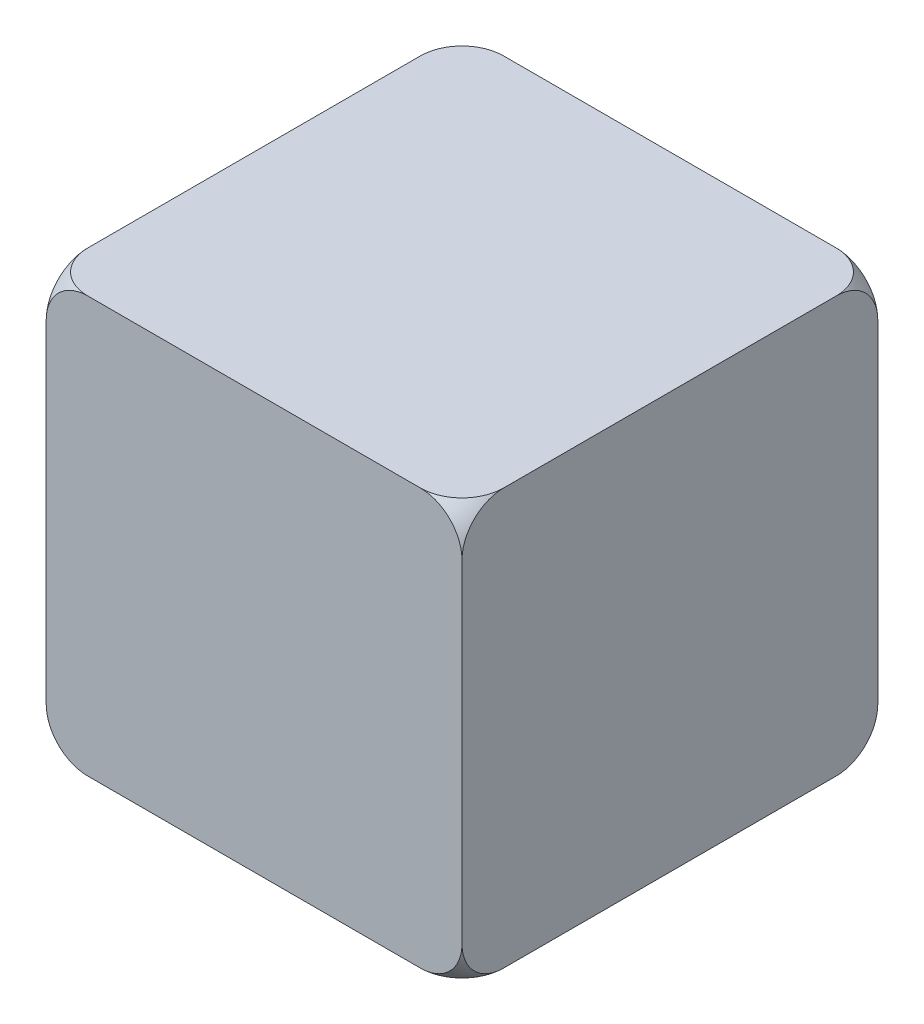
ISO-10303-21;
HEADER;
FILE_DESCRIPTION(('STEP AP214'),'2;1');
FILE_NAME('part.step','',(''),(''),'','','');
FILE_SCHEMA(('AUTOMOTIVE_DESIGN { 1 0 10303 214 1 1 1 1 }'));
ENDSEC;
DATA;
#1=APPLICATION_CONTEXT('core data for automotive mechanical design processes');
#2=APPLICATION_PROTOCOL_DEFINITION('international standard','automotive_design',2000,#1);
#3=PRODUCT_CONTEXT('',#1,'mechanical');
#4=PRODUCT('Part','Part','',(#3));
#5=PRODUCT_RELATED_PRODUCT_CATEGORY('part','',(#4));
#6=PRODUCT_DEFINITION_FORMATION('','',#4);
#7=PRODUCT_DEFINITION_CONTEXT('part definition',#1,'design');
#8=PRODUCT_DEFINITION('design','',#6,#7);
#9=PRODUCT_DEFINITION_SHAPE('','',#8);
#10=(LENGTH_UNIT() NAMED_UNIT(*) SI_UNIT(.MILLI.,.METRE.));
#11=(NAMED_UNIT(*) PLANE_ANGLE_UNIT() SI_UNIT($,.RADIAN.));
#12=(NAMED_UNIT(*) SI_UNIT($,.STERADIAN.) SOLID_ANGLE_UNIT());
#13=UNCERTAINTY_MEASURE_WITH_UNIT(LENGTH_MEASURE(1.E-05),#10,'distance_accuracy_value','');
#14=(GEOMETRIC_REPRESENTATION_CONTEXT(3) GLOBAL_UNCERTAINTY_ASSIGNED_CONTEXT((#13)) GLOBAL_UNIT_ASSIGNED_CONTEXT((#10,
#11,#12)) REPRESENTATION_CONTEXT('',''));
#15=CARTESIAN_POINT('',(0.,0.,0.));
#16=DIRECTION('',(0.,0.,1.));
#17=DIRECTION('',(1.,0.,0.));
#18=AXIS2_PLACEMENT_3D('',#15,#16,#17);
#19=CARTESIAN_POINT('',(0.,0.,-0.414213562373095));
#20=DIRECTION('',(-1.,0.,0.));
#21=DIRECTION('',(0.,0.,1.));
#22=AXIS2_PLACEMENT_3D('',#19,#20,#21);
#23=PLANE('',#22);
#24=DIRECTION('',(0.,-1.,0.));
#25=VECTOR('',#24,1.);
#26=CARTESIAN_POINT('',(0.,9.,0.));
#27=LINE('',#26,#25);
#28=CARTESIAN_POINT('',(0.,9.,0.));
#29=VERTEX_POINT('',#28);
#30=CARTESIAN_POINT('',(0.,1.,0.));
#31=VERTEX_POINT('',#30);
#32=EDGE_CURVE('E135',#29,#31,#27,.T.);
#33=ORIENTED_EDGE('',*,*,#32,.T.);
#34=CARTESIAN_POINT('',(0.,1.,1.));
#35=DIRECTION('',(-1.,0.,0.));
#36=DIRECTION('',(0.,0.,1.));
#37=AXIS2_PLACEMENT_3D('',#34,#35,#36);
#38=CIRCLE('',#37,1.);
#39=CARTESIAN_POINT('',(0.,0.,1.));
#40=VERTEX_POINT('',#39);
#41=EDGE_CURVE('E41',#31,#40,#38,.T.);
#42=ORIENTED_EDGE('',*,*,#41,.T.);
#43=DIRECTION('',(0.,0.,-1.));
#44=VECTOR('',#43,1.);
#45=CARTESIAN_POINT('',(0.,0.,9.));
#46=LINE('',#45,#44);
#47=CARTESIAN_POINT('',(0.,0.,9.));
#48=VERTEX_POINT('',#47);
#49=EDGE_CURVE('E48',#48,#40,#46,.T.);
#50=ORIENTED_EDGE('',*,*,#49,.F.);
#51=CARTESIAN_POINT('',(0.,1.,9.));
#52=DIRECTION('',(-1.,0.,0.));
#53=DIRECTION('',(0.,0.,1.));
#54=AXIS2_PLACEMENT_3D('',#51,#52,#53);
#55=CIRCLE('',#54,1.);
#56=CARTESIAN_POINT('',(0.,1.,10.));
#57=VERTEX_POINT('',#56);
#58=EDGE_CURVE('E109',#48,#57,#55,.T.);
#59=ORIENTED_EDGE('',*,*,#58,.T.);
#60=DIRECTION('',(0.,-1.,0.));
#61=VECTOR('',#60,1.);
#62=CARTESIAN_POINT('',(0.,9.,10.));
#63=LINE('',#62,#61);
#64=CARTESIAN_POINT('',(0.,9.,10.));
#65=VERTEX_POINT('',#64);
#66=EDGE_CURVE('E233',#65,#57,#63,.T.);
#67=ORIENTED_EDGE('',*,*,#66,.F.);
#68=CARTESIAN_POINT('',(0.,9.,9.));
#69=DIRECTION('',(-1.,0.,0.));
#70=DIRECTION('',(0.,0.,1.));
#71=AXIS2_PLACEMENT_3D('',#68,#69,#70);
#72=CIRCLE('',#71,1.00000000000001);
#73=CARTESIAN_POINT('',(0.,10.,9.));
#74=VERTEX_POINT('',#73);
#75=EDGE_CURVE('E79',#65,#74,#72,.T.);
#76=ORIENTED_EDGE('',*,*,#75,.T.);
#77=DIRECTION('',(0.,0.,-1.));
#78=VECTOR('',#77,1.);
#79=CARTESIAN_POINT('',(0.,10.,9.));
#80=LINE('',#79,#78);
#81=CARTESIAN_POINT('',(0.,10.,1.));
#82=VERTEX_POINT('',#81);
#83=EDGE_CURVE('E70',#74,#82,#80,.T.);
#84=ORIENTED_EDGE('',*,*,#83,.T.);
#85=CARTESIAN_POINT('',(0.,9.,1.));
#86=DIRECTION('',(-1.,0.,0.));
#87=DIRECTION('',(0.,0.,1.));
#88=AXIS2_PLACEMENT_3D('',#85,#86,#87);
#89=CIRCLE('',#88,1.00000000000001);
#90=EDGE_CURVE('E75',#82,#29,#89,.T.);
#91=ORIENTED_EDGE('',*,*,#90,.T.);
#92=EDGE_LOOP('',(#33,#42,#50,#59,#67,#76,#84,#91));
#93=FACE_BOUND('',#92,.T.);
#94=ADVANCED_FACE('F33',(#93),#23,.T.);
#95=CARTESIAN_POINT('',(0.,0.,-0.414213562373095));
#96=DIRECTION('',(0.,-1.,0.));
#97=DIRECTION('',(0.,0.,-1.));
#98=AXIS2_PLACEMENT_3D('',#95,#96,#97);
#99=PLANE('',#98);
#100=CARTESIAN_POINT('',(1.,0.,1.));
#101=DIRECTION('',(0.,-1.,0.));
#102=DIRECTION('',(0.,0.,-1.));
#103=AXIS2_PLACEMENT_3D('',#100,#101,#102);
#104=CIRCLE('',#103,1.);
#105=CARTESIAN_POINT('',(0.999999999999988,0.,0.));
#106=VERTEX_POINT('',#105);
#107=EDGE_CURVE('E130',#40,#106,#104,.T.);
#108=ORIENTED_EDGE('',*,*,#107,.T.);
#109=DIRECTION('',(-1.,0.,0.));
#110=VECTOR('',#109,1.);
#111=CARTESIAN_POINT('',(8.99999999999999,0.,0.));
#112=LINE('',#111,#110);
#113=CARTESIAN_POINT('',(8.99999999999999,0.,0.));
#114=VERTEX_POINT('',#113);
#115=EDGE_CURVE('E143',#114,#106,#112,.T.);
#116=ORIENTED_EDGE('',*,*,#115,.F.);
#117=CARTESIAN_POINT('',(9.,0.,1.));
#118=DIRECTION('',(0.,-1.,0.));
#119=DIRECTION('',(0.,0.,-1.));
#120=AXIS2_PLACEMENT_3D('',#117,#118,#119);
#121=CIRCLE('',#120,0.999999999999998);
#122=CARTESIAN_POINT('',(10.,0.,1.));
#123=VERTEX_POINT('',#122);
#124=EDGE_CURVE('E122',#114,#123,#121,.T.);
#125=ORIENTED_EDGE('',*,*,#124,.T.);
#126=DIRECTION('',(0.,0.,-1.));
#127=VECTOR('',#126,1.);
#128=CARTESIAN_POINT('',(9.99999999999999,0.,9.));
#129=LINE('',#128,#127);
#130=CARTESIAN_POINT('',(9.99999999999999,0.,9.));
#131=VERTEX_POINT('',#130);
#132=EDGE_CURVE('E56',#131,#123,#129,.T.);
#133=ORIENTED_EDGE('',*,*,#132,.F.);
#134=CARTESIAN_POINT('',(9.,0.,9.));
#135=DIRECTION('',(0.,-1.,0.));
#136=DIRECTION('',(0.,0.,-1.));
#137=AXIS2_PLACEMENT_3D('',#134,#135,#136);
#138=CIRCLE('',#137,0.999999999999998);
#139=CARTESIAN_POINT('',(8.99999999999999,0.,10.));
#140=VERTEX_POINT('',#139);
#141=EDGE_CURVE('E117',#131,#140,#138,.T.);
#142=ORIENTED_EDGE('',*,*,#141,.T.);
#143=DIRECTION('',(-1.,0.,0.));
#144=VECTOR('',#143,1.);
#145=CARTESIAN_POINT('',(8.99999999999999,0.,10.));
#146=LINE('',#145,#144);
#147=CARTESIAN_POINT('',(0.999999999999988,0.,10.));
#148=VERTEX_POINT('',#147);
#149=EDGE_CURVE('E192',#140,#148,#146,.T.);
#150=ORIENTED_EDGE('',*,*,#149,.T.);
#151=CARTESIAN_POINT('',(1.,0.,9.));
#152=DIRECTION('',(0.,-1.,0.));
#153=DIRECTION('',(0.,0.,-1.));
#154=AXIS2_PLACEMENT_3D('',#151,#152,#153);
#155=CIRCLE('',#154,1.);
#156=EDGE_CURVE('E107',#148,#48,#155,.T.);
#157=ORIENTED_EDGE('',*,*,#156,.T.);
#158=ORIENTED_EDGE('',*,*,#49,.T.);
#159=EDGE_LOOP('',(#108,#116,#125,#133,#142,#150,#157,#158));
#160=FACE_BOUND('',#159,.T.);
#161=ADVANCED_FACE('F140',(#160),#99,.T.);
#162=CARTESIAN_POINT('',(1.,1.,1.));
#163=DIRECTION('',(1.,0.,0.));
#164=DIRECTION('',(0.,-1.,0.));
#165=AXIS2_PLACEMENT_3D('',#162,#163,#164);
#166=SPHERICAL_SURFACE('',#165,1.4142135623731);
#167=ORIENTED_EDGE('',*,*,#41,.F.);
#168=CARTESIAN_POINT('',(1.,1.,0.));
#169=DIRECTION('',(0.,0.,1.));
#170=DIRECTION('',(1.,0.,0.));
#171=AXIS2_PLACEMENT_3D('',#168,#169,#170);
#172=CIRCLE('',#171,1.);
#173=EDGE_CURVE('E11',#31,#106,#172,.T.);
#174=ORIENTED_EDGE('',*,*,#173,.T.);
#175=ORIENTED_EDGE('',*,*,#107,.F.);
#176=EDGE_LOOP('',(#167,#174,#175));
#177=FACE_BOUND('',#176,.T.);
#178=ADVANCED_FACE('F35',(#177),#166,.T.);
#179=CARTESIAN_POINT('',(20.,0.,0.));
#180=DIRECTION('',(0.,0.,1.));
#181=DIRECTION('',(1.,0.,0.));
#182=AXIS2_PLACEMENT_3D('',#179,#180,#181);
#183=PLANE('',#182);
#184=ORIENTED_EDGE('',*,*,#173,.F.);
#185=ORIENTED_EDGE('',*,*,#32,.F.);
#186=CARTESIAN_POINT('',(0.999999999999988,9.,0.));
#187=DIRECTION('',(0.,0.,1.));
#188=DIRECTION('',(1.,0.,0.));
#189=AXIS2_PLACEMENT_3D('',#186,#187,#188);
#190=CIRCLE('',#189,1.);
#191=CARTESIAN_POINT('',(0.999999999999988,10.,0.));
#192=VERTEX_POINT('',#191);
#193=EDGE_CURVE('E99',#192,#29,#190,.T.);
#194=ORIENTED_EDGE('',*,*,#193,.F.);
#195=DIRECTION('',(-1.,0.,0.));
#196=VECTOR('',#195,1.);
#197=CARTESIAN_POINT('',(8.99999999999999,10.,0.));
#198=LINE('',#197,#196);
#199=CARTESIAN_POINT('',(8.99999999999999,10.,0.));
#200=VERTEX_POINT('',#199);
#201=EDGE_CURVE('E92',#200,#192,#198,.T.);
#202=ORIENTED_EDGE('',*,*,#201,.F.);
#203=CARTESIAN_POINT('',(8.99999999999999,9.,0.));
#204=DIRECTION('',(0.,0.,1.));
#205=DIRECTION('',(1.,0.,0.));
#206=AXIS2_PLACEMENT_3D('',#203,#204,#205);
#207=CIRCLE('',#206,0.999999999999998);
#208=CARTESIAN_POINT('',(9.99999999999999,9.,0.));
#209=VERTEX_POINT('',#208);
#210=EDGE_CURVE('E225',#209,#200,#207,.T.);
#211=ORIENTED_EDGE('',*,*,#210,.F.);
#212=DIRECTION('',(0.,-1.,0.));
#213=VECTOR('',#212,1.);
#214=CARTESIAN_POINT('',(10.,9.,0.));
#215=LINE('',#214,#213);
#216=CARTESIAN_POINT('',(10.,1.,0.));
#217=VERTEX_POINT('',#216);
#218=EDGE_CURVE('E208',#209,#217,#215,.T.);
#219=ORIENTED_EDGE('',*,*,#218,.T.);
#220=CARTESIAN_POINT('',(9.,1.,0.));
#221=DIRECTION('',(0.,0.,1.));
#222=DIRECTION('',(1.,0.,0.));
#223=AXIS2_PLACEMENT_3D('',#220,#221,#222);
#224=CIRCLE('',#223,0.999999999999998);
#225=EDGE_CURVE('E124',#114,#217,#224,.T.);
#226=ORIENTED_EDGE('',*,*,#225,.F.);
#227=ORIENTED_EDGE('',*,*,#115,.T.);
#228=EDGE_LOOP('',(#184,#185,#194,#202,#211,#219,#226,#227));
#229=FACE_BOUND('',#228,.T.);
#230=ADVANCED_FACE('F236',(#229),#183,.F.);
#231=CARTESIAN_POINT('',(9.99999999999999,10.,9.));
#232=DIRECTION('',(-1.,0.,0.));
#233=DIRECTION('',(0.,0.,1.));
#234=AXIS2_PLACEMENT_3D('',#231,#232,#233);
#235=PLANE('',#234);
#236=CARTESIAN_POINT('',(10.,9.,9.));
#237=DIRECTION('',(1.,0.,0.));
#238=DIRECTION('',(0.,0.,-1.));
#239=AXIS2_PLACEMENT_3D('',#236,#237,#238);
#240=CIRCLE('',#239,0.999999999999985);
#241=CARTESIAN_POINT('',(9.99999999999999,10.,9.));
#242=VERTEX_POINT('',#241);
#243=CARTESIAN_POINT('',(10.,9.,9.99999999999999));
#244=VERTEX_POINT('',#243);
#245=EDGE_CURVE('E215',#242,#244,#240,.T.);
#246=ORIENTED_EDGE('',*,*,#245,.T.);
#247=DIRECTION('',(0.,-1.,0.));
#248=VECTOR('',#247,1.);
#249=CARTESIAN_POINT('',(10.,9.,10.));
#250=LINE('',#249,#248);
#251=CARTESIAN_POINT('',(10.,1.,10.));
#252=VERTEX_POINT('',#251);
#253=EDGE_CURVE('E188',#244,#252,#250,.T.);
#254=ORIENTED_EDGE('',*,*,#253,.T.);
#255=CARTESIAN_POINT('',(10.,1.,9.));
#256=DIRECTION('',(1.,0.,0.));
#257=DIRECTION('',(0.,0.,-1.));
#258=AXIS2_PLACEMENT_3D('',#255,#256,#257);
#259=CIRCLE('',#258,0.999999999999999);
#260=EDGE_CURVE('E115',#252,#131,#259,.T.);
#261=ORIENTED_EDGE('',*,*,#260,.T.);
#262=ORIENTED_EDGE('',*,*,#132,.T.);
#263=CARTESIAN_POINT('',(10.,1.,1.));
#264=DIRECTION('',(1.,0.,0.));
#265=DIRECTION('',(0.,0.,-1.));
#266=AXIS2_PLACEMENT_3D('',#263,#264,#265);
#267=CIRCLE('',#266,0.999999999999999);
#268=EDGE_CURVE('E119',#123,#217,#267,.T.);
#269=ORIENTED_EDGE('',*,*,#268,.T.);
#270=ORIENTED_EDGE('',*,*,#218,.F.);
#271=CARTESIAN_POINT('',(10.,9.,1.));
#272=DIRECTION('',(1.,0.,0.));
#273=DIRECTION('',(0.,0.,-1.));
#274=AXIS2_PLACEMENT_3D('',#271,#272,#273);
#275=CIRCLE('',#274,0.999999999999985);
#276=CARTESIAN_POINT('',(9.99999999999999,10.,1.));
#277=VERTEX_POINT('',#276);
#278=EDGE_CURVE('E218',#209,#277,#275,.T.);
#279=ORIENTED_EDGE('',*,*,#278,.T.);
#280=DIRECTION('',(0.,0.,-1.));
#281=VECTOR('',#280,1.);
#282=CARTESIAN_POINT('',(9.99999999999999,10.,9.));
#283=LINE('',#282,#281);
#284=EDGE_CURVE('E83',#242,#277,#283,.T.);
#285=ORIENTED_EDGE('',*,*,#284,.F.);
#286=EDGE_LOOP('',(#246,#254,#261,#262,#269,#270,#279,#285));
#287=FACE_BOUND('',#286,.T.);
#288=ADVANCED_FACE('F183',(#287),#235,.F.);
#289=CARTESIAN_POINT('',(9.99999999999999,10.,9.));
#290=DIRECTION('',(0.,-1.,0.));
#291=DIRECTION('',(0.,0.,-1.));
#292=AXIS2_PLACEMENT_3D('',#289,#290,#291);
#293=PLANE('',#292);
#294=CARTESIAN_POINT('',(8.99999999999999,10.,1.));
#295=DIRECTION('',(0.,1.,0.));
#296=DIRECTION('',(0.,0.,1.));
#297=AXIS2_PLACEMENT_3D('',#294,#295,#296);
#298=CIRCLE('',#297,0.999999999999997);
#299=EDGE_CURVE('E223',#277,#200,#298,.T.);
#300=ORIENTED_EDGE('',*,*,#299,.T.);
#301=ORIENTED_EDGE('',*,*,#201,.T.);
#302=CARTESIAN_POINT('',(0.999999999999988,10.,1.));
#303=DIRECTION('',(0.,1.,0.));
#304=DIRECTION('',(0.,0.,1.));
#305=AXIS2_PLACEMENT_3D('',#302,#303,#304);
#306=CIRCLE('',#305,1.);
#307=EDGE_CURVE('E87',#192,#82,#306,.T.);
#308=ORIENTED_EDGE('',*,*,#307,.T.);
#309=ORIENTED_EDGE('',*,*,#83,.F.);
#310=CARTESIAN_POINT('',(0.999999999999988,10.,9.));
#311=DIRECTION('',(0.,1.,0.));
#312=DIRECTION('',(0.,0.,1.));
#313=AXIS2_PLACEMENT_3D('',#310,#311,#312);
#314=CIRCLE('',#313,1.);
#315=CARTESIAN_POINT('',(0.999999999999988,10.,10.));
#316=VERTEX_POINT('',#315);
#317=EDGE_CURVE('E96',#74,#316,#314,.T.);
#318=ORIENTED_EDGE('',*,*,#317,.T.);
#319=DIRECTION('',(-1.,0.,0.));
#320=VECTOR('',#319,1.);
#321=CARTESIAN_POINT('',(8.99999999999999,10.,10.));
#322=LINE('',#321,#320);
#323=CARTESIAN_POINT('',(8.99999999999999,10.,10.));
#324=VERTEX_POINT('',#323);
#325=EDGE_CURVE('E201',#324,#316,#322,.T.);
#326=ORIENTED_EDGE('',*,*,#325,.F.);
#327=CARTESIAN_POINT('',(8.99999999999999,10.,9.));
#328=DIRECTION('',(0.,1.,0.));
#329=DIRECTION('',(0.,0.,1.));
#330=AXIS2_PLACEMENT_3D('',#327,#328,#329);
#331=CIRCLE('',#330,0.999999999999997);
#332=EDGE_CURVE('E204',#324,#242,#331,.T.);
#333=ORIENTED_EDGE('',*,*,#332,.T.);
#334=ORIENTED_EDGE('',*,*,#284,.T.);
#335=EDGE_LOOP('',(#300,#301,#308,#309,#318,#326,#333,#334));
#336=FACE_BOUND('',#335,.T.);
#337=ADVANCED_FACE('F89',(#336),#293,.F.);
#338=CARTESIAN_POINT('',(9.,1.,1.));
#339=DIRECTION('',(1.,0.,0.));
#340=DIRECTION('',(0.,1.,0.));
#341=AXIS2_PLACEMENT_3D('',#338,#339,#340);
#342=SPHERICAL_SURFACE('',#341,1.41421356237309);
#343=ORIENTED_EDGE('',*,*,#124,.F.);
#344=ORIENTED_EDGE('',*,*,#225,.T.);
#345=ORIENTED_EDGE('',*,*,#268,.F.);
#346=EDGE_LOOP('',(#343,#344,#345));
#347=FACE_BOUND('',#346,.T.);
#348=ADVANCED_FACE('F178',(#347),#342,.T.);
#349=CARTESIAN_POINT('',(9.,1.,9.));
#350=DIRECTION('',(1.,0.,0.));
#351=DIRECTION('',(0.,1.,0.));
#352=AXIS2_PLACEMENT_3D('',#349,#350,#351);
#353=SPHERICAL_SURFACE('',#352,1.41421356237309);
#354=ORIENTED_EDGE('',*,*,#260,.F.);
#355=CARTESIAN_POINT('',(9.,0.999999999999998,10.));
#356=DIRECTION('',(0.,0.,-1.));
#357=DIRECTION('',(0.,1.,0.));
#358=AXIS2_PLACEMENT_3D('',#355,#356,#357);
#359=CIRCLE('',#358,0.999999999999999);
#360=EDGE_CURVE('E112',#252,#140,#359,.T.);
#361=ORIENTED_EDGE('',*,*,#360,.T.);
#362=ORIENTED_EDGE('',*,*,#141,.F.);
#363=EDGE_LOOP('',(#354,#361,#362));
#364=FACE_BOUND('',#363,.T.);
#365=ADVANCED_FACE('F190',(#364),#353,.T.);
#366=CARTESIAN_POINT('',(20.,0.,10.));
#367=DIRECTION('',(0.,0.,-1.));
#368=DIRECTION('',(0.,1.,0.));
#369=AXIS2_PLACEMENT_3D('',#366,#367,#368);
#370=PLANE('',#369);
#371=CARTESIAN_POINT('',(0.999999999999988,8.99999999999999,9.99999999999999));
#372=DIRECTION('',(0.,0.,-1.));
#373=DIRECTION('',(0.,1.,0.));
#374=AXIS2_PLACEMENT_3D('',#371,#372,#373);
#375=CIRCLE('',#374,1.00000000000002);
#376=EDGE_CURVE('E228',#65,#316,#375,.T.);
#377=ORIENTED_EDGE('',*,*,#376,.F.);
#378=ORIENTED_EDGE('',*,*,#66,.T.);
#379=CARTESIAN_POINT('',(1.,0.999999999999998,10.));
#380=DIRECTION('',(0.,0.,-1.));
#381=DIRECTION('',(0.,1.,0.));
#382=AXIS2_PLACEMENT_3D('',#379,#380,#381);
#383=CIRCLE('',#382,1.);
#384=EDGE_CURVE('E101',#148,#57,#383,.T.);
#385=ORIENTED_EDGE('',*,*,#384,.F.);
#386=ORIENTED_EDGE('',*,*,#149,.F.);
#387=ORIENTED_EDGE('',*,*,#360,.F.);
#388=ORIENTED_EDGE('',*,*,#253,.F.);
#389=CARTESIAN_POINT('',(8.99999999999999,8.99999999999999,9.99999999999999));
#390=DIRECTION('',(0.,0.,-1.));
#391=DIRECTION('',(0.,1.,0.));
#392=AXIS2_PLACEMENT_3D('',#389,#390,#391);
#393=CIRCLE('',#392,1.00000000000001);
#394=EDGE_CURVE('E210',#324,#244,#393,.T.);
#395=ORIENTED_EDGE('',*,*,#394,.F.);
#396=ORIENTED_EDGE('',*,*,#325,.T.);
#397=EDGE_LOOP('',(#377,#378,#385,#386,#387,#388,#395,#396));
#398=FACE_BOUND('',#397,.T.);
#399=ADVANCED_FACE('F211',(#398),#370,.F.);
#400=CARTESIAN_POINT('',(1.,1.,9.));
#401=DIRECTION('',(1.,0.,0.));
#402=DIRECTION('',(0.,-1.,0.));
#403=AXIS2_PLACEMENT_3D('',#400,#401,#402);
#404=SPHERICAL_SURFACE('',#403,1.4142135623731);
#405=ORIENTED_EDGE('',*,*,#156,.F.);
#406=ORIENTED_EDGE('',*,*,#384,.T.);
#407=ORIENTED_EDGE('',*,*,#58,.F.);
#408=EDGE_LOOP('',(#405,#406,#407));
#409=FACE_BOUND('',#408,.T.);
#410=ADVANCED_FACE('F274',(#409),#404,.T.);
#411=CARTESIAN_POINT('',(0.999999999999988,9.,1.));
#412=DIRECTION('',(1.,0.,0.));
#413=DIRECTION('',(0.,-1.,0.));
#414=AXIS2_PLACEMENT_3D('',#411,#412,#413);
#415=SPHERICAL_SURFACE('',#414,1.4142135623731);
#416=ORIENTED_EDGE('',*,*,#307,.F.);
#417=ORIENTED_EDGE('',*,*,#193,.T.);
#418=ORIENTED_EDGE('',*,*,#90,.F.);
#419=EDGE_LOOP('',(#416,#417,#418));
#420=FACE_BOUND('',#419,.T.);
#421=ADVANCED_FACE('F98',(#420),#415,.T.);
#422=CARTESIAN_POINT('',(0.999999999999988,9.,9.));
#423=DIRECTION('',(1.,0.,0.));
#424=DIRECTION('',(0.,-1.,0.));
#425=AXIS2_PLACEMENT_3D('',#422,#423,#424);
#426=SPHERICAL_SURFACE('',#425,1.4142135623731);
#427=ORIENTED_EDGE('',*,*,#75,.F.);
#428=ORIENTED_EDGE('',*,*,#376,.T.);
#429=ORIENTED_EDGE('',*,*,#317,.F.);
#430=EDGE_LOOP('',(#427,#428,#429));
#431=FACE_BOUND('',#430,.T.);
#432=ADVANCED_FACE('F231',(#431),#426,.T.);
#433=CARTESIAN_POINT('',(8.99999999999999,9.,1.));
#434=DIRECTION('',(1.,0.,0.));
#435=DIRECTION('',(0.,1.,0.));
#436=AXIS2_PLACEMENT_3D('',#433,#434,#435);
#437=SPHERICAL_SURFACE('',#436,1.41421356237309);
#438=ORIENTED_EDGE('',*,*,#278,.F.);
#439=ORIENTED_EDGE('',*,*,#210,.T.);
#440=ORIENTED_EDGE('',*,*,#299,.F.);
#441=EDGE_LOOP('',(#438,#439,#440));
#442=FACE_BOUND('',#441,.T.);
#443=ADVANCED_FACE('F247',(#442),#437,.T.);
#444=CARTESIAN_POINT('',(8.99999999999999,9.,9.));
#445=DIRECTION('',(1.,0.,0.));
#446=DIRECTION('',(0.,1.,0.));
#447=AXIS2_PLACEMENT_3D('',#444,#445,#446);
#448=SPHERICAL_SURFACE('',#447,1.41421356237309);
#449=ORIENTED_EDGE('',*,*,#332,.F.);
#450=ORIENTED_EDGE('',*,*,#394,.T.);
#451=ORIENTED_EDGE('',*,*,#245,.F.);
#452=EDGE_LOOP('',(#449,#450,#451));
#453=FACE_BOUND('',#452,.T.);
#454=ADVANCED_FACE('F214',(#453),#448,.T.);
#455=CLOSED_SHELL('',(#94,#161,#178,#230,#288,#337,#348,#365,#399,#410,#421,#432,#443,#454));
#456=MANIFOLD_SOLID_BREP('B2',#455);
#457=ADVANCED_BREP_SHAPE_REPRESENTATION('',(#18,#456),#14);
#458=SHAPE_DEFINITION_REPRESENTATION(#9,#457);
ENDSEC;
END-ISO-10303-21;
